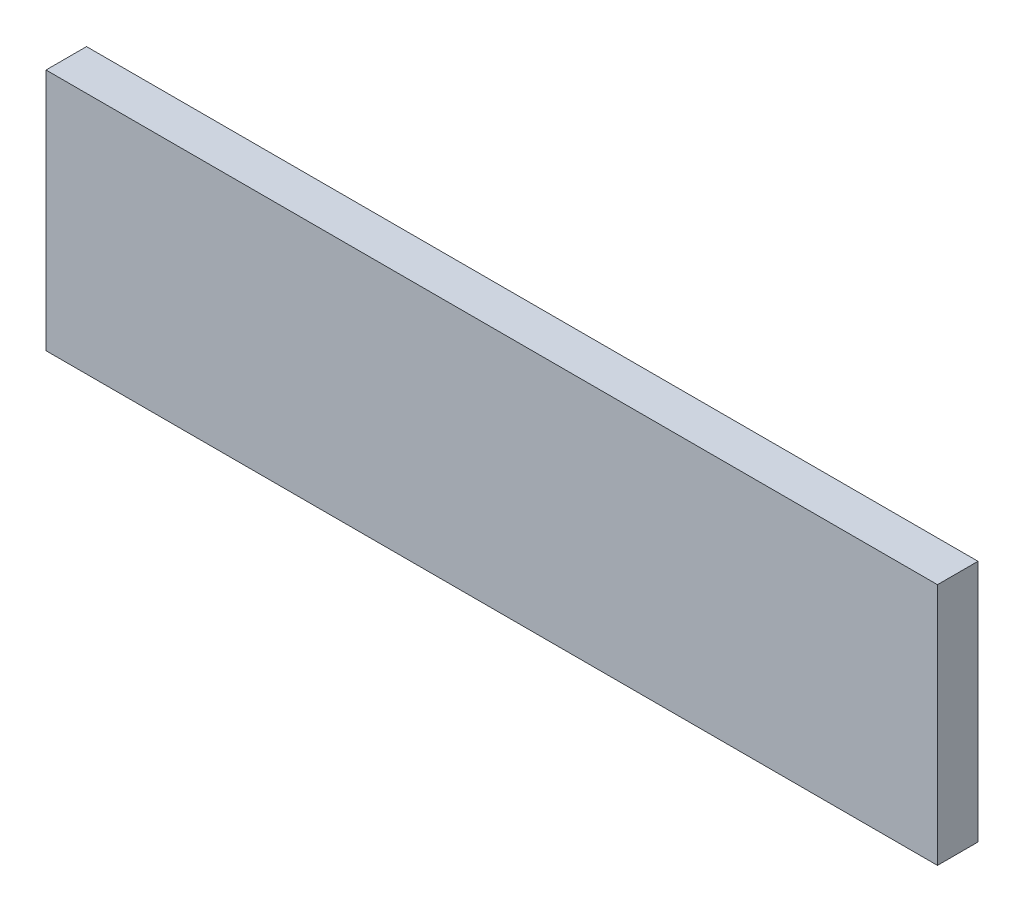
ISO-10303-21;
HEADER;
FILE_DESCRIPTION(('STEP AP214'),'2;1');
FILE_NAME('part.step','',(''),(''),'','','');
FILE_SCHEMA(('AUTOMOTIVE_DESIGN { 1 0 10303 214 1 1 1 1 }'));
ENDSEC;
DATA;
#1=APPLICATION_CONTEXT('core data for automotive mechanical design processes');
#2=APPLICATION_PROTOCOL_DEFINITION('international standard','automotive_design',2000,#1);
#3=PRODUCT_CONTEXT('',#1,'mechanical');
#4=PRODUCT('Part','Part','',(#3));
#5=PRODUCT_RELATED_PRODUCT_CATEGORY('part','',(#4));
#6=PRODUCT_DEFINITION_FORMATION('','',#4);
#7=PRODUCT_DEFINITION_CONTEXT('part definition',#1,'design');
#8=PRODUCT_DEFINITION('design','',#6,#7);
#9=PRODUCT_DEFINITION_SHAPE('','',#8);
#10=(LENGTH_UNIT() NAMED_UNIT(*) SI_UNIT(.MILLI.,.METRE.));
#11=(NAMED_UNIT(*) PLANE_ANGLE_UNIT() SI_UNIT($,.RADIAN.));
#12=(NAMED_UNIT(*) SI_UNIT($,.STERADIAN.) SOLID_ANGLE_UNIT());
#13=UNCERTAINTY_MEASURE_WITH_UNIT(LENGTH_MEASURE(1.E-05),#10,'distance_accuracy_value','');
#14=(GEOMETRIC_REPRESENTATION_CONTEXT(3) GLOBAL_UNCERTAINTY_ASSIGNED_CONTEXT((#13)) GLOBAL_UNIT_ASSIGNED_CONTEXT((#10,
#11,#12)) REPRESENTATION_CONTEXT('',''));
#15=CARTESIAN_POINT('',(0.,0.,0.));
#16=DIRECTION('',(0.,0.,1.));
#17=DIRECTION('',(1.,0.,0.));
#18=AXIS2_PLACEMENT_3D('',#15,#16,#17);
#19=CARTESIAN_POINT('',(1117.6,0.,0.));
#20=DIRECTION('',(0.,0.,-1.));
#21=DIRECTION('',(-1.,0.,0.));
#22=AXIS2_PLACEMENT_3D('',#19,#20,#21);
#23=PLANE('',#22);
#24=DIRECTION('',(0.,-1.,0.));
#25=VECTOR('',#24,1.);
#26=CARTESIAN_POINT('',(0.,0.,0.));
#27=LINE('',#26,#25);
#28=CARTESIAN_POINT('',(0.,304.8,0.));
#29=VERTEX_POINT('',#28);
#30=CARTESIAN_POINT('',(0.,0.,0.));
#31=VERTEX_POINT('',#30);
#32=EDGE_CURVE('E95',#29,#31,#27,.T.);
#33=ORIENTED_EDGE('',*,*,#32,.T.);
#34=DIRECTION('',(-1.,0.,0.));
#35=VECTOR('',#34,1.);
#36=CARTESIAN_POINT('',(1117.6,0.,0.));
#37=LINE('',#36,#35);
#38=CARTESIAN_POINT('',(1117.6,0.,0.));
#39=VERTEX_POINT('',#38);
#40=EDGE_CURVE('E11',#39,#31,#37,.T.);
#41=ORIENTED_EDGE('',*,*,#40,.F.);
#42=DIRECTION('',(0.,-1.,0.));
#43=VECTOR('',#42,1.);
#44=CARTESIAN_POINT('',(1117.6,0.,0.));
#45=LINE('',#44,#43);
#46=CARTESIAN_POINT('',(1117.6,304.8,0.));
#47=VERTEX_POINT('',#46);
#48=EDGE_CURVE('E83',#47,#39,#45,.T.);
#49=ORIENTED_EDGE('',*,*,#48,.F.);
#50=DIRECTION('',(-1.,0.,0.));
#51=VECTOR('',#50,1.);
#52=CARTESIAN_POINT('',(1117.6,304.8,0.));
#53=LINE('',#52,#51);
#54=EDGE_CURVE('E91',#47,#29,#53,.T.);
#55=ORIENTED_EDGE('',*,*,#54,.T.);
#56=EDGE_LOOP('',(#33,#41,#49,#55));
#57=FACE_BOUND('',#56,.T.);
#58=ADVANCED_FACE('F32',(#57),#23,.F.);
#59=CARTESIAN_POINT('',(1117.6,0.,0.));
#60=DIRECTION('',(0.,1.,0.));
#61=DIRECTION('',(0.,0.,1.));
#62=AXIS2_PLACEMENT_3D('',#59,#60,#61);
#63=PLANE('',#62);
#64=DIRECTION('',(0.,0.,-1.));
#65=VECTOR('',#64,1.);
#66=CARTESIAN_POINT('',(0.,0.,0.));
#67=LINE('',#66,#65);
#68=CARTESIAN_POINT('',(0.,0.,-50.8));
#69=VERTEX_POINT('',#68);
#70=EDGE_CURVE('E87',#31,#69,#67,.T.);
#71=ORIENTED_EDGE('',*,*,#70,.T.);
#72=DIRECTION('',(-1.,0.,0.));
#73=VECTOR('',#72,1.);
#74=CARTESIAN_POINT('',(1117.6,0.,-50.8));
#75=LINE('',#74,#73);
#76=CARTESIAN_POINT('',(1117.6,0.,-50.8));
#77=VERTEX_POINT('',#76);
#78=EDGE_CURVE('E40',#77,#69,#75,.T.);
#79=ORIENTED_EDGE('',*,*,#78,.F.);
#80=DIRECTION('',(0.,0.,-1.));
#81=VECTOR('',#80,1.);
#82=CARTESIAN_POINT('',(1117.6,0.,0.));
#83=LINE('',#82,#81);
#84=EDGE_CURVE('E78',#39,#77,#83,.T.);
#85=ORIENTED_EDGE('',*,*,#84,.F.);
#86=ORIENTED_EDGE('',*,*,#40,.T.);
#87=EDGE_LOOP('',(#71,#79,#85,#86));
#88=FACE_BOUND('',#87,.T.);
#89=ADVANCED_FACE('F86',(#88),#63,.F.);
#90=CARTESIAN_POINT('',(1117.6,0.,-50.8));
#91=DIRECTION('',(0.,0.,1.));
#92=DIRECTION('',(1.,0.,0.));
#93=AXIS2_PLACEMENT_3D('',#90,#91,#92);
#94=PLANE('',#93);
#95=DIRECTION('',(0.,1.,0.));
#96=VECTOR('',#95,1.);
#97=CARTESIAN_POINT('',(0.,0.,-50.8));
#98=LINE('',#97,#96);
#99=CARTESIAN_POINT('',(0.,304.8,-50.8));
#100=VERTEX_POINT('',#99);
#101=EDGE_CURVE('E65',#69,#100,#98,.T.);
#102=ORIENTED_EDGE('',*,*,#101,.T.);
#103=DIRECTION('',(-1.,0.,0.));
#104=VECTOR('',#103,1.);
#105=CARTESIAN_POINT('',(1117.6,304.8,-50.8));
#106=LINE('',#105,#104);
#107=CARTESIAN_POINT('',(1117.6,304.8,-50.8));
#108=VERTEX_POINT('',#107);
#109=EDGE_CURVE('E88',#108,#100,#106,.T.);
#110=ORIENTED_EDGE('',*,*,#109,.F.);
#111=DIRECTION('',(0.,1.,0.));
#112=VECTOR('',#111,1.);
#113=CARTESIAN_POINT('',(1117.6,0.,-50.8));
#114=LINE('',#113,#112);
#115=EDGE_CURVE('E81',#77,#108,#114,.T.);
#116=ORIENTED_EDGE('',*,*,#115,.F.);
#117=ORIENTED_EDGE('',*,*,#78,.T.);
#118=EDGE_LOOP('',(#102,#110,#116,#117));
#119=FACE_BOUND('',#118,.T.);
#120=ADVANCED_FACE('F89',(#119),#94,.F.);
#121=CARTESIAN_POINT('',(1117.6,304.8,0.));
#122=DIRECTION('',(0.,-1.,0.));
#123=DIRECTION('',(0.,0.,-1.));
#124=AXIS2_PLACEMENT_3D('',#121,#122,#123);
#125=PLANE('',#124);
#126=DIRECTION('',(0.,0.,1.));
#127=VECTOR('',#126,1.);
#128=CARTESIAN_POINT('',(0.,304.8,0.));
#129=LINE('',#128,#127);
#130=EDGE_CURVE('E71',#100,#29,#129,.T.);
#131=ORIENTED_EDGE('',*,*,#130,.T.);
#132=ORIENTED_EDGE('',*,*,#54,.F.);
#133=DIRECTION('',(0.,0.,1.));
#134=VECTOR('',#133,1.);
#135=CARTESIAN_POINT('',(1117.6,304.8,0.));
#136=LINE('',#135,#134);
#137=EDGE_CURVE('E48',#108,#47,#136,.T.);
#138=ORIENTED_EDGE('',*,*,#137,.F.);
#139=ORIENTED_EDGE('',*,*,#109,.T.);
#140=EDGE_LOOP('',(#131,#132,#138,#139));
#141=FACE_BOUND('',#140,.T.);
#142=ADVANCED_FACE('F102',(#141),#125,.F.);
#143=CARTESIAN_POINT('',(1117.6,0.,0.));
#144=DIRECTION('',(-1.,0.,0.));
#145=DIRECTION('',(0.,0.,1.));
#146=AXIS2_PLACEMENT_3D('',#143,#144,#145);
#147=PLANE('',#146);
#148=ORIENTED_EDGE('',*,*,#48,.T.);
#149=ORIENTED_EDGE('',*,*,#84,.T.);
#150=ORIENTED_EDGE('',*,*,#115,.T.);
#151=ORIENTED_EDGE('',*,*,#137,.T.);
#152=EDGE_LOOP('',(#148,#149,#150,#151));
#153=FACE_BOUND('',#152,.T.);
#154=ADVANCED_FACE('F79',(#153),#147,.F.);
#155=CARTESIAN_POINT('',(0.,0.,0.));
#156=DIRECTION('',(-1.,0.,0.));
#157=DIRECTION('',(0.,0.,1.));
#158=AXIS2_PLACEMENT_3D('',#155,#156,#157);
#159=PLANE('',#158);
#160=ORIENTED_EDGE('',*,*,#32,.F.);
#161=ORIENTED_EDGE('',*,*,#130,.F.);
#162=ORIENTED_EDGE('',*,*,#101,.F.);
#163=ORIENTED_EDGE('',*,*,#70,.F.);
#164=EDGE_LOOP('',(#160,#161,#162,#163));
#165=FACE_BOUND('',#164,.T.);
#166=ADVANCED_FACE('F105',(#165),#159,.T.);
#167=CLOSED_SHELL('',(#58,#89,#120,#142,#154,#166));
#168=MANIFOLD_SOLID_BREP('B2',#167);
#169=ADVANCED_BREP_SHAPE_REPRESENTATION('',(#18,#168),#14);
#170=SHAPE_DEFINITION_REPRESENTATION(#9,#169);
ENDSEC;
END-ISO-10303-21;
